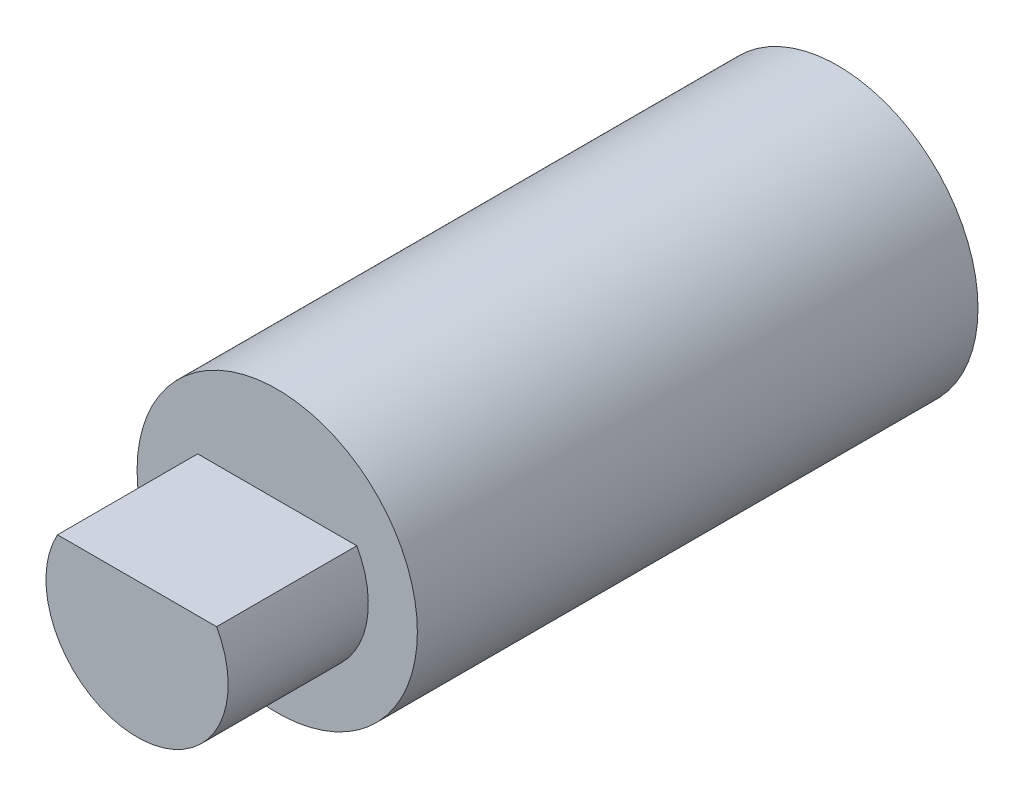
ISO-10303-21;
HEADER;
FILE_DESCRIPTION(('STEP AP214'),'2;1');
FILE_NAME('part.step','',(''),(''),'','','');
FILE_SCHEMA(('AUTOMOTIVE_DESIGN { 1 0 10303 214 1 1 1 1 }'));
ENDSEC;
DATA;
#1=APPLICATION_CONTEXT('core data for automotive mechanical design processes');
#2=APPLICATION_PROTOCOL_DEFINITION('international standard','automotive_design',2000,#1);
#3=PRODUCT_CONTEXT('',#1,'mechanical');
#4=PRODUCT('Part','Part','',(#3));
#5=PRODUCT_RELATED_PRODUCT_CATEGORY('part','',(#4));
#6=PRODUCT_DEFINITION_FORMATION('','',#4);
#7=PRODUCT_DEFINITION_CONTEXT('part definition',#1,'design');
#8=PRODUCT_DEFINITION('design','',#6,#7);
#9=PRODUCT_DEFINITION_SHAPE('','',#8);
#10=(LENGTH_UNIT() NAMED_UNIT(*) SI_UNIT(.MILLI.,.METRE.));
#11=(NAMED_UNIT(*) PLANE_ANGLE_UNIT() SI_UNIT($,.RADIAN.));
#12=(NAMED_UNIT(*) SI_UNIT($,.STERADIAN.) SOLID_ANGLE_UNIT());
#13=UNCERTAINTY_MEASURE_WITH_UNIT(LENGTH_MEASURE(1.E-05),#10,'distance_accuracy_value','');
#14=(GEOMETRIC_REPRESENTATION_CONTEXT(3) GLOBAL_UNCERTAINTY_ASSIGNED_CONTEXT((#13)) GLOBAL_UNIT_ASSIGNED_CONTEXT((#10,
#11,#12)) REPRESENTATION_CONTEXT('',''));
#15=CARTESIAN_POINT('',(0.,0.,0.));
#16=DIRECTION('',(0.,0.,1.));
#17=DIRECTION('',(1.,0.,0.));
#18=AXIS2_PLACEMENT_3D('',#15,#16,#17);
#19=CARTESIAN_POINT('',(0.,0.,0.));
#20=DIRECTION('',(0.,0.,1.));
#21=DIRECTION('',(1.,0.,0.));
#22=AXIS2_PLACEMENT_3D('',#19,#20,#21);
#23=PLANE('',#22);
#24=CARTESIAN_POINT('',(0.,0.,0.));
#25=DIRECTION('',(0.,0.,1.));
#26=DIRECTION('',(1.,0.,0.));
#27=AXIS2_PLACEMENT_3D('',#24,#25,#26);
#28=CIRCLE('',#27,3.);
#29=CARTESIAN_POINT('',(3.,0.,0.));
#30=VERTEX_POINT('',#29);
#31=EDGE_CURVE('E11',#30,#30,#28,.T.);
#32=ORIENTED_EDGE('',*,*,#31,.F.);
#33=EDGE_LOOP('',(#32));
#34=FACE_BOUND('',#33,.T.);
#35=CARTESIAN_POINT('',(0.,0.,0.));
#36=DIRECTION('',(0.,0.,1.));
#37=DIRECTION('',(1.,0.,0.));
#38=AXIS2_PLACEMENT_3D('',#35,#36,#37);
#39=CIRCLE('',#38,1.6);
#40=CARTESIAN_POINT('',(-1.16189500386223,1.1,0.));
#41=VERTEX_POINT('',#40);
#42=CARTESIAN_POINT('',(1.16189500386223,1.1,0.));
#43=VERTEX_POINT('',#42);
#44=EDGE_CURVE('E105',#41,#43,#39,.T.);
#45=ORIENTED_EDGE('',*,*,#44,.T.);
#46=DIRECTION('',(-1.,0.,0.));
#47=VECTOR('',#46,1.);
#48=CARTESIAN_POINT('',(-1.16189500386223,1.1,0.));
#49=LINE('',#48,#47);
#50=EDGE_CURVE('E114',#43,#41,#49,.T.);
#51=ORIENTED_EDGE('',*,*,#50,.T.);
#52=EDGE_LOOP('',(#45,#51));
#53=FACE_BOUND('',#52,.T.);
#54=ADVANCED_FACE('F39',(#34,#53),#23,.F.);
#55=CARTESIAN_POINT('',(0.,0.,10.));
#56=DIRECTION('',(0.,0.,-1.));
#57=DIRECTION('',(-1.,0.,0.));
#58=AXIS2_PLACEMENT_3D('',#55,#56,#57);
#59=CYLINDRICAL_SURFACE('',#58,3.);
#60=ORIENTED_EDGE('',*,*,#31,.T.);
#61=EDGE_LOOP('',(#60));
#62=FACE_BOUND('',#61,.T.);
#63=CARTESIAN_POINT('',(0.,0.,12.));
#64=DIRECTION('',(0.,0.,1.));
#65=DIRECTION('',(1.,0.,0.));
#66=AXIS2_PLACEMENT_3D('',#63,#64,#65);
#67=CIRCLE('',#66,3.);
#68=CARTESIAN_POINT('',(3.,0.,12.));
#69=VERTEX_POINT('',#68);
#70=EDGE_CURVE('E100',#69,#69,#67,.T.);
#71=ORIENTED_EDGE('',*,*,#70,.F.);
#72=EDGE_LOOP('',(#71));
#73=FACE_BOUND('',#72,.T.);
#74=ADVANCED_FACE('F41',(#62,#73),#59,.T.);
#75=CARTESIAN_POINT('',(0.,0.,10.));
#76=DIRECTION('',(0.,0.,-1.));
#77=DIRECTION('',(-1.,0.,0.));
#78=AXIS2_PLACEMENT_3D('',#75,#76,#77);
#79=CYLINDRICAL_SURFACE('',#78,1.6);
#80=ORIENTED_EDGE('',*,*,#44,.F.);
#81=DIRECTION('',(0.,0.,-1.));
#82=VECTOR('',#81,1.);
#83=CARTESIAN_POINT('',(-1.16189500386223,1.1,10.));
#84=LINE('',#83,#82);
#85=CARTESIAN_POINT('',(-1.16189500386223,1.1,10.));
#86=VERTEX_POINT('',#85);
#87=EDGE_CURVE('E117',#86,#41,#84,.T.);
#88=ORIENTED_EDGE('',*,*,#87,.F.);
#89=CARTESIAN_POINT('',(0.,0.,10.));
#90=DIRECTION('',(0.,0.,1.));
#91=DIRECTION('',(1.,0.,0.));
#92=AXIS2_PLACEMENT_3D('',#89,#90,#91);
#93=CIRCLE('',#92,1.6);
#94=CARTESIAN_POINT('',(1.16189500386223,1.1,10.));
#95=VERTEX_POINT('',#94);
#96=EDGE_CURVE('E110',#86,#95,#93,.T.);
#97=ORIENTED_EDGE('',*,*,#96,.T.);
#98=DIRECTION('',(0.,0.,-1.));
#99=VECTOR('',#98,1.);
#100=CARTESIAN_POINT('',(1.16189500386223,1.1,10.));
#101=LINE('',#100,#99);
#102=EDGE_CURVE('E48',#95,#43,#101,.T.);
#103=ORIENTED_EDGE('',*,*,#102,.T.);
#104=EDGE_LOOP('',(#80,#88,#97,#103));
#105=FACE_BOUND('',#104,.T.);
#106=ADVANCED_FACE('F129',(#105),#79,.F.);
#107=CARTESIAN_POINT('',(-1.16189500386223,1.1,10.));
#108=DIRECTION('',(0.,-1.,0.));
#109=DIRECTION('',(0.,0.,-1.));
#110=AXIS2_PLACEMENT_3D('',#107,#108,#109);
#111=PLANE('',#110);
#112=ORIENTED_EDGE('',*,*,#50,.F.);
#113=ORIENTED_EDGE('',*,*,#102,.F.);
#114=DIRECTION('',(-1.,0.,0.));
#115=VECTOR('',#114,1.);
#116=CARTESIAN_POINT('',(-1.16189500386223,1.1,10.));
#117=LINE('',#116,#115);
#118=EDGE_CURVE('E61',#95,#86,#117,.T.);
#119=ORIENTED_EDGE('',*,*,#118,.T.);
#120=ORIENTED_EDGE('',*,*,#87,.T.);
#121=EDGE_LOOP('',(#112,#113,#119,#120));
#122=FACE_BOUND('',#121,.T.);
#123=ADVANCED_FACE('F133',(#122),#111,.T.);
#124=CARTESIAN_POINT('',(0.,0.,10.));
#125=DIRECTION('',(0.,0.,1.));
#126=DIRECTION('',(1.,0.,0.));
#127=AXIS2_PLACEMENT_3D('',#124,#125,#126);
#128=PLANE('',#127);
#129=ORIENTED_EDGE('',*,*,#118,.F.);
#130=ORIENTED_EDGE('',*,*,#96,.F.);
#131=EDGE_LOOP('',(#129,#130));
#132=FACE_BOUND('',#131,.T.);
#133=ADVANCED_FACE('F135',(#132),#128,.F.);
#134=CARTESIAN_POINT('',(0.,0.,12.));
#135=DIRECTION('',(0.,0.,1.));
#136=DIRECTION('',(1.,0.,0.));
#137=AXIS2_PLACEMENT_3D('',#134,#135,#136);
#138=PLANE('',#137);
#139=CARTESIAN_POINT('',(0.,0.,12.));
#140=DIRECTION('',(0.,0.,1.));
#141=DIRECTION('',(1.,0.,0.));
#142=AXIS2_PLACEMENT_3D('',#139,#140,#141);
#143=CIRCLE('',#142,1.95);
#144=CARTESIAN_POINT('',(-1.70293863659264,0.95,12.));
#145=VERTEX_POINT('',#144);
#146=CARTESIAN_POINT('',(1.70293863659264,0.95,12.));
#147=VERTEX_POINT('',#146);
#148=EDGE_CURVE('E98',#145,#147,#143,.T.);
#149=ORIENTED_EDGE('',*,*,#148,.F.);
#150=DIRECTION('',(-1.,0.,0.));
#151=VECTOR('',#150,1.);
#152=CARTESIAN_POINT('',(-1.70293863659264,0.95,12.));
#153=LINE('',#152,#151);
#154=EDGE_CURVE('E54',#147,#145,#153,.T.);
#155=ORIENTED_EDGE('',*,*,#154,.F.);
#156=EDGE_LOOP('',(#149,#155));
#157=FACE_BOUND('',#156,.T.);
#158=ORIENTED_EDGE('',*,*,#70,.T.);
#159=EDGE_LOOP('',(#158));
#160=FACE_BOUND('',#159,.T.);
#161=ADVANCED_FACE('F141',(#157,#160),#138,.T.);
#162=CARTESIAN_POINT('',(0.,0.,15.));
#163=DIRECTION('',(0.,0.,-1.));
#164=DIRECTION('',(-1.,0.,0.));
#165=AXIS2_PLACEMENT_3D('',#162,#163,#164);
#166=CYLINDRICAL_SURFACE('',#165,1.95);
#167=ORIENTED_EDGE('',*,*,#148,.T.);
#168=DIRECTION('',(0.,0.,-1.));
#169=VECTOR('',#168,1.);
#170=CARTESIAN_POINT('',(1.70293863659264,0.95,15.));
#171=LINE('',#170,#169);
#172=CARTESIAN_POINT('',(1.70293863659264,0.95,15.));
#173=VERTEX_POINT('',#172);
#174=EDGE_CURVE('E84',#173,#147,#171,.T.);
#175=ORIENTED_EDGE('',*,*,#174,.F.);
#176=CARTESIAN_POINT('',(0.,0.,15.));
#177=DIRECTION('',(0.,0.,1.));
#178=DIRECTION('',(1.,0.,0.));
#179=AXIS2_PLACEMENT_3D('',#176,#177,#178);
#180=CIRCLE('',#179,1.95);
#181=CARTESIAN_POINT('',(-1.70293863659264,0.95,15.));
#182=VERTEX_POINT('',#181);
#183=EDGE_CURVE('E91',#182,#173,#180,.T.);
#184=ORIENTED_EDGE('',*,*,#183,.F.);
#185=DIRECTION('',(0.,0.,-1.));
#186=VECTOR('',#185,1.);
#187=CARTESIAN_POINT('',(-1.70293863659264,0.95,15.));
#188=LINE('',#187,#186);
#189=EDGE_CURVE('E87',#182,#145,#188,.T.);
#190=ORIENTED_EDGE('',*,*,#189,.T.);
#191=EDGE_LOOP('',(#167,#175,#184,#190));
#192=FACE_BOUND('',#191,.T.);
#193=ADVANCED_FACE('F97',(#192),#166,.T.);
#194=CARTESIAN_POINT('',(-1.70293863659264,0.95,15.));
#195=DIRECTION('',(0.,-1.,0.));
#196=DIRECTION('',(0.,0.,-1.));
#197=AXIS2_PLACEMENT_3D('',#194,#195,#196);
#198=PLANE('',#197);
#199=ORIENTED_EDGE('',*,*,#154,.T.);
#200=ORIENTED_EDGE('',*,*,#189,.F.);
#201=DIRECTION('',(-1.,0.,0.));
#202=VECTOR('',#201,1.);
#203=CARTESIAN_POINT('',(-1.70293863659264,0.95,15.));
#204=LINE('',#203,#202);
#205=EDGE_CURVE('E80',#173,#182,#204,.T.);
#206=ORIENTED_EDGE('',*,*,#205,.F.);
#207=ORIENTED_EDGE('',*,*,#174,.T.);
#208=EDGE_LOOP('',(#199,#200,#206,#207));
#209=FACE_BOUND('',#208,.T.);
#210=ADVANCED_FACE('F82',(#209),#198,.F.);
#211=CARTESIAN_POINT('',(0.,0.,15.));
#212=DIRECTION('',(0.,0.,1.));
#213=DIRECTION('',(1.,0.,0.));
#214=AXIS2_PLACEMENT_3D('',#211,#212,#213);
#215=PLANE('',#214);
#216=ORIENTED_EDGE('',*,*,#183,.T.);
#217=ORIENTED_EDGE('',*,*,#205,.T.);
#218=EDGE_LOOP('',(#216,#217));
#219=FACE_BOUND('',#218,.T.);
#220=ADVANCED_FACE('F93',(#219),#215,.T.);
#221=CLOSED_SHELL('',(#54,#74,#106,#123,#133,#161,#193,#210,#220));
#222=MANIFOLD_SOLID_BREP('B2',#221);
#223=ADVANCED_BREP_SHAPE_REPRESENTATION('',(#18,#222),#14);
#224=SHAPE_DEFINITION_REPRESENTATION(#9,#223);
ENDSEC;
END-ISO-10303-21;
